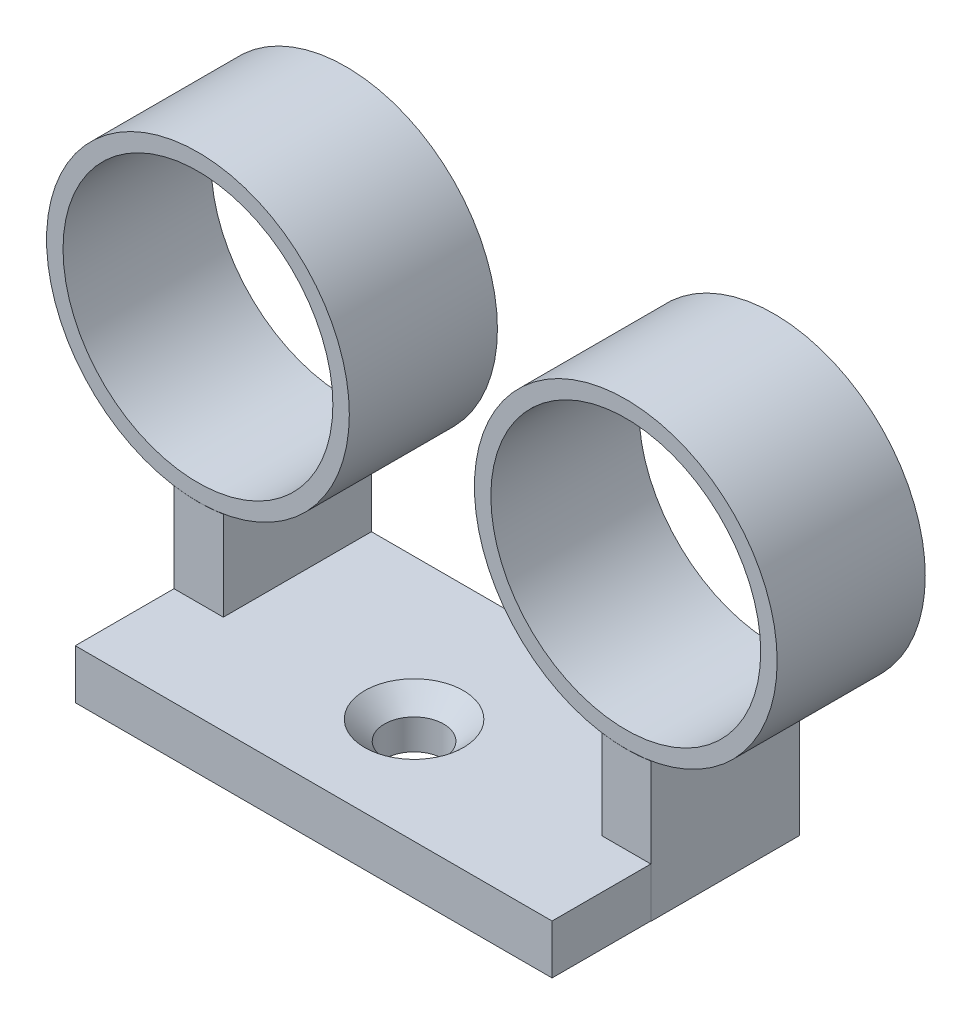
ISO-10303-21;
HEADER;
FILE_DESCRIPTION(('STEP AP214'),'2;1');
FILE_NAME('part.step','',(''),(''),'','','');
FILE_SCHEMA(('AUTOMOTIVE_DESIGN { 1 0 10303 214 1 1 1 1 }'));
ENDSEC;
DATA;
#1=APPLICATION_CONTEXT('core data for automotive mechanical design processes');
#2=APPLICATION_PROTOCOL_DEFINITION('international standard','automotive_design',2000,#1);
#3=PRODUCT_CONTEXT('',#1,'mechanical');
#4=PRODUCT('Part','Part','',(#3));
#5=PRODUCT_RELATED_PRODUCT_CATEGORY('part','',(#4));
#6=PRODUCT_DEFINITION_FORMATION('','',#4);
#7=PRODUCT_DEFINITION_CONTEXT('part definition',#1,'design');
#8=PRODUCT_DEFINITION('design','',#6,#7);
#9=PRODUCT_DEFINITION_SHAPE('','',#8);
#10=(LENGTH_UNIT() NAMED_UNIT(*) SI_UNIT(.MILLI.,.METRE.));
#11=(NAMED_UNIT(*) PLANE_ANGLE_UNIT() SI_UNIT($,.RADIAN.));
#12=(NAMED_UNIT(*) SI_UNIT($,.STERADIAN.) SOLID_ANGLE_UNIT());
#13=UNCERTAINTY_MEASURE_WITH_UNIT(LENGTH_MEASURE(1.E-05),#10,'distance_accuracy_value','');
#14=(GEOMETRIC_REPRESENTATION_CONTEXT(3) GLOBAL_UNCERTAINTY_ASSIGNED_CONTEXT((#13)) GLOBAL_UNIT_ASSIGNED_CONTEXT((#10,
#11,#12)) REPRESENTATION_CONTEXT('',''));
#15=CARTESIAN_POINT('',(0.,0.,0.));
#16=DIRECTION('',(0.,0.,1.));
#17=DIRECTION('',(1.,0.,0.));
#18=AXIS2_PLACEMENT_3D('',#15,#16,#17);
#19=CARTESIAN_POINT('',(0.,3.43905375415282,0.));
#20=DIRECTION('',(0.,1.,0.));
#21=DIRECTION('',(0.,0.,1.));
#22=AXIS2_PLACEMENT_3D('',#19,#20,#21);
#23=PLANE('',#22);
#24=CARTESIAN_POINT('',(14.1563485968457,3.43905375415282,8.56621810474091));
#25=DIRECTION('',(0.,1.,0.));
#26=DIRECTION('',(0.,0.,1.));
#27=AXIS2_PLACEMENT_3D('',#24,#25,#26);
#28=CIRCLE('',#27,3.);
#29=CARTESIAN_POINT('',(14.1563485968457,3.43905375415282,11.5662181047409));
#30=VERTEX_POINT('',#29);
#31=EDGE_CURVE('E297',#30,#30,#28,.T.);
#32=ORIENTED_EDGE('',*,*,#31,.F.);
#33=EDGE_LOOP('',(#32));
#34=FACE_BOUND('',#33,.T.);
#35=DIRECTION('',(1.,0.,0.));
#36=VECTOR('',#35,1.);
#37=CARTESIAN_POINT('',(0.,3.43905375415282,9.));
#38=LINE('',#37,#36);
#39=CARTESIAN_POINT('',(26.,3.43905375415282,9.));
#40=VERTEX_POINT('',#39);
#41=CARTESIAN_POINT('',(28.9773860584858,3.43905375415282,9.));
#42=VERTEX_POINT('',#41);
#43=EDGE_CURVE('E147',#40,#42,#38,.T.);
#44=ORIENTED_EDGE('',*,*,#43,.F.);
#45=DIRECTION('',(0.,0.,-1.));
#46=VECTOR('',#45,1.);
#47=CARTESIAN_POINT('',(26.,3.43905375415282,0.));
#48=LINE('',#47,#46);
#49=CARTESIAN_POINT('',(26.,3.43905375415282,0.));
#50=VERTEX_POINT('',#49);
#51=EDGE_CURVE('E12',#40,#50,#48,.T.);
#52=ORIENTED_EDGE('',*,*,#51,.T.);
#53=DIRECTION('',(1.,0.,0.));
#54=VECTOR('',#53,1.);
#55=CARTESIAN_POINT('',(0.,3.43905375415282,0.));
#56=LINE('',#55,#54);
#57=CARTESIAN_POINT('',(3.,3.43905375415282,0.));
#58=VERTEX_POINT('',#57);
#59=EDGE_CURVE('E173',#58,#50,#56,.T.);
#60=ORIENTED_EDGE('',*,*,#59,.F.);
#61=DIRECTION('',(0.,0.,-1.));
#62=VECTOR('',#61,1.);
#63=CARTESIAN_POINT('',(3.,3.43905375415282,9.));
#64=LINE('',#63,#62);
#65=CARTESIAN_POINT('',(3.,3.43905375415282,9.));
#66=VERTEX_POINT('',#65);
#67=EDGE_CURVE('E192',#66,#58,#64,.T.);
#68=ORIENTED_EDGE('',*,*,#67,.F.);
#69=DIRECTION('',(-1.,0.,0.));
#70=VECTOR('',#69,1.);
#71=CARTESIAN_POINT('',(1.5,3.43905375415282,9.));
#72=LINE('',#71,#70);
#73=CARTESIAN_POINT('',(0.,3.43905375415282,9.));
#74=VERTEX_POINT('',#73);
#75=EDGE_CURVE('E62',#66,#74,#72,.T.);
#76=ORIENTED_EDGE('',*,*,#75,.T.);
#77=DIRECTION('',(0.,0.,-1.));
#78=VECTOR('',#77,1.);
#79=CARTESIAN_POINT('',(0.,3.43905375415282,0.));
#80=LINE('',#79,#78);
#81=CARTESIAN_POINT('',(0.,3.43905375415282,15.));
#82=VERTEX_POINT('',#81);
#83=EDGE_CURVE('E170',#82,#74,#80,.T.);
#84=ORIENTED_EDGE('',*,*,#83,.F.);
#85=DIRECTION('',(-1.,0.,0.));
#86=VECTOR('',#85,1.);
#87=CARTESIAN_POINT('',(0.,3.43905375415282,15.));
#88=LINE('',#87,#86);
#89=CARTESIAN_POINT('',(28.9773860584858,3.43905375415282,15.));
#90=VERTEX_POINT('',#89);
#91=EDGE_CURVE('E179',#90,#82,#88,.T.);
#92=ORIENTED_EDGE('',*,*,#91,.F.);
#93=DIRECTION('',(0.,0.,1.));
#94=VECTOR('',#93,1.);
#95=CARTESIAN_POINT('',(28.9773860584858,3.43905375415282,0.));
#96=LINE('',#95,#94);
#97=EDGE_CURVE('E177',#42,#90,#96,.T.);
#98=ORIENTED_EDGE('',*,*,#97,.F.);
#99=EDGE_LOOP('',(#44,#52,#60,#68,#76,#84,#92,#98));
#100=FACE_BOUND('',#99,.T.);
#101=ADVANCED_FACE('F46',(#34,#100),#23,.T.);
#102=CARTESIAN_POINT('',(0.,0.439053754152822,9.));
#103=DIRECTION('',(1.,0.,0.));
#104=DIRECTION('',(0.,0.,-1.));
#105=AXIS2_PLACEMENT_3D('',#102,#103,#104);
#106=PLANE('',#105);
#107=DIRECTION('',(0.,-1.,0.));
#108=VECTOR('',#107,1.);
#109=CARTESIAN_POINT('',(0.,0.439053754152822,0.));
#110=LINE('',#109,#108);
#111=CARTESIAN_POINT('',(0.,8.85905375415282,0.));
#112=VERTEX_POINT('',#111);
#113=CARTESIAN_POINT('',(0.,0.439053754152822,0.));
#114=VERTEX_POINT('',#113);
#115=EDGE_CURVE('E194',#112,#114,#110,.T.);
#116=ORIENTED_EDGE('',*,*,#115,.T.);
#117=DIRECTION('',(0.,0.,-1.));
#118=VECTOR('',#117,1.);
#119=CARTESIAN_POINT('',(0.,0.439053754152822,9.));
#120=LINE('',#119,#118);
#121=CARTESIAN_POINT('',(0.,0.439053754152822,15.));
#122=VERTEX_POINT('',#121);
#123=EDGE_CURVE('E212',#122,#114,#120,.T.);
#124=ORIENTED_EDGE('',*,*,#123,.F.);
#125=DIRECTION('',(0.,-1.,0.));
#126=VECTOR('',#125,1.);
#127=CARTESIAN_POINT('',(0.,3.43905375415282,15.));
#128=LINE('',#127,#126);
#129=EDGE_CURVE('E186',#82,#122,#128,.T.);
#130=ORIENTED_EDGE('',*,*,#129,.F.);
#131=ORIENTED_EDGE('',*,*,#83,.T.);
#132=DIRECTION('',(0.,-1.,0.));
#133=VECTOR('',#132,1.);
#134=CARTESIAN_POINT('',(0.,0.439053754152822,9.));
#135=LINE('',#134,#133);
#136=CARTESIAN_POINT('',(0.,8.85905375415282,9.));
#137=VERTEX_POINT('',#136);
#138=EDGE_CURVE('E67',#137,#74,#135,.T.);
#139=ORIENTED_EDGE('',*,*,#138,.F.);
#140=DIRECTION('',(0.,0.,-1.));
#141=VECTOR('',#140,1.);
#142=CARTESIAN_POINT('',(0.,8.85905375415282,9.));
#143=LINE('',#142,#141);
#144=EDGE_CURVE('E201',#137,#112,#143,.T.);
#145=ORIENTED_EDGE('',*,*,#144,.T.);
#146=EDGE_LOOP('',(#116,#124,#130,#131,#139,#145));
#147=FACE_BOUND('',#146,.T.);
#148=ADVANCED_FACE('F48',(#147),#106,.F.);
#149=CARTESIAN_POINT('',(0.,0.439053754152822,9.));
#150=DIRECTION('',(0.,1.,0.));
#151=DIRECTION('',(0.,0.,1.));
#152=AXIS2_PLACEMENT_3D('',#149,#150,#151);
#153=PLANE('',#152);
#154=CARTESIAN_POINT('',(14.1563485968457,0.439053754152822,8.56621810474091));
#155=DIRECTION('',(0.,1.,0.));
#156=DIRECTION('',(0.,0.,1.));
#157=AXIS2_PLACEMENT_3D('',#154,#155,#156);
#158=CIRCLE('',#157,1.79999999999999);
#159=CARTESIAN_POINT('',(14.1563485968457,0.439053754152822,10.3662181047409));
#160=VERTEX_POINT('',#159);
#161=EDGE_CURVE('E50',#160,#160,#158,.T.);
#162=ORIENTED_EDGE('',*,*,#161,.T.);
#163=EDGE_LOOP('',(#162));
#164=FACE_BOUND('',#163,.T.);
#165=DIRECTION('',(1.,0.,0.));
#166=VECTOR('',#165,1.);
#167=CARTESIAN_POINT('',(0.,0.439053754152822,0.));
#168=LINE('',#167,#166);
#169=CARTESIAN_POINT('',(29.,0.439053754152822,0.));
#170=VERTEX_POINT('',#169);
#171=EDGE_CURVE('E144',#114,#170,#168,.T.);
#172=ORIENTED_EDGE('',*,*,#171,.T.);
#173=DIRECTION('',(0.,0.,-1.));
#174=VECTOR('',#173,1.);
#175=CARTESIAN_POINT('',(29.,0.439053754152822,9.));
#176=LINE('',#175,#174);
#177=CARTESIAN_POINT('',(29.,0.439053754152822,9.));
#178=VERTEX_POINT('',#177);
#179=EDGE_CURVE('E140',#178,#170,#176,.T.);
#180=ORIENTED_EDGE('',*,*,#179,.F.);
#181=DIRECTION('',(1.,0.,0.));
#182=VECTOR('',#181,1.);
#183=CARTESIAN_POINT('',(26.,0.439053754152822,9.));
#184=LINE('',#183,#182);
#185=CARTESIAN_POINT('',(28.9773860584858,0.439053754152822,9.));
#186=VERTEX_POINT('',#185);
#187=EDGE_CURVE('E127',#186,#178,#184,.T.);
#188=ORIENTED_EDGE('',*,*,#187,.F.);
#189=DIRECTION('',(0.,0.,1.));
#190=VECTOR('',#189,1.);
#191=CARTESIAN_POINT('',(28.9773860584858,0.439053754152822,0.));
#192=LINE('',#191,#190);
#193=CARTESIAN_POINT('',(28.9773860584858,0.439053754152822,15.));
#194=VERTEX_POINT('',#193);
#195=EDGE_CURVE('E169',#186,#194,#192,.T.);
#196=ORIENTED_EDGE('',*,*,#195,.T.);
#197=DIRECTION('',(-1.,0.,0.));
#198=VECTOR('',#197,1.);
#199=CARTESIAN_POINT('',(0.,0.439053754152822,15.));
#200=LINE('',#199,#198);
#201=EDGE_CURVE('E174',#194,#122,#200,.T.);
#202=ORIENTED_EDGE('',*,*,#201,.T.);
#203=ORIENTED_EDGE('',*,*,#123,.T.);
#204=EDGE_LOOP('',(#172,#180,#188,#196,#202,#203));
#205=FACE_BOUND('',#204,.T.);
#206=ADVANCED_FACE('F141',(#164,#205),#153,.F.);
#207=CARTESIAN_POINT('',(3.,0.439053754152822,9.));
#208=DIRECTION('',(-1.,0.,0.));
#209=DIRECTION('',(0.,0.,1.));
#210=AXIS2_PLACEMENT_3D('',#207,#208,#209);
#211=PLANE('',#210);
#212=DIRECTION('',(0.,1.,0.));
#213=VECTOR('',#212,1.);
#214=CARTESIAN_POINT('',(3.,0.439053754152822,9.));
#215=LINE('',#214,#213);
#216=CARTESIAN_POINT('',(3.,8.85905375415282,9.));
#217=VERTEX_POINT('',#216);
#218=EDGE_CURVE('E196',#66,#217,#215,.T.);
#219=ORIENTED_EDGE('',*,*,#218,.F.);
#220=ORIENTED_EDGE('',*,*,#67,.T.);
#221=DIRECTION('',(0.,1.,0.));
#222=VECTOR('',#221,1.);
#223=CARTESIAN_POINT('',(3.,0.439053754152822,0.));
#224=LINE('',#223,#222);
#225=CARTESIAN_POINT('',(3.,8.85905375415282,0.));
#226=VERTEX_POINT('',#225);
#227=EDGE_CURVE('E204',#58,#226,#224,.T.);
#228=ORIENTED_EDGE('',*,*,#227,.T.);
#229=DIRECTION('',(0.,0.,-1.));
#230=VECTOR('',#229,1.);
#231=CARTESIAN_POINT('',(3.,8.85905375415282,9.));
#232=LINE('',#231,#230);
#233=EDGE_CURVE('E209',#217,#226,#232,.T.);
#234=ORIENTED_EDGE('',*,*,#233,.F.);
#235=EDGE_LOOP('',(#219,#220,#228,#234));
#236=FACE_BOUND('',#235,.T.);
#237=ADVANCED_FACE('F243',(#236),#211,.F.);
#238=CARTESIAN_POINT('',(1.5,18.0414987254526,9.));
#239=DIRECTION('',(0.,0.,-1.));
#240=DIRECTION('',(-1.,0.,0.));
#241=AXIS2_PLACEMENT_3D('',#238,#239,#240);
#242=CYLINDRICAL_SURFACE('',#241,9.30415475209594);
#243=CARTESIAN_POINT('',(1.5,18.0414987254526,0.));
#244=DIRECTION('',(0.,0.,-1.));
#245=DIRECTION('',(1.,0.,0.));
#246=AXIS2_PLACEMENT_3D('',#243,#244,#245);
#247=CIRCLE('',#246,9.30415475209594);
#248=EDGE_CURVE('E197',#226,#112,#247,.T.);
#249=ORIENTED_EDGE('',*,*,#248,.T.);
#250=ORIENTED_EDGE('',*,*,#144,.F.);
#251=CARTESIAN_POINT('',(1.5,18.0414987254526,9.));
#252=DIRECTION('',(0.,0.,-1.));
#253=DIRECTION('',(1.,0.,0.));
#254=AXIS2_PLACEMENT_3D('',#251,#252,#253);
#255=CIRCLE('',#254,9.30415475209594);
#256=EDGE_CURVE('E199',#217,#137,#255,.T.);
#257=ORIENTED_EDGE('',*,*,#256,.F.);
#258=ORIENTED_EDGE('',*,*,#233,.T.);
#259=EDGE_LOOP('',(#249,#250,#257,#258));
#260=FACE_BOUND('',#259,.T.);
#261=ADVANCED_FACE('F244',(#260),#242,.F.);
#262=CARTESIAN_POINT('',(1.5,18.0414987254526,9.));
#263=DIRECTION('',(0.,0.,1.));
#264=DIRECTION('',(1.,0.,0.));
#265=AXIS2_PLACEMENT_3D('',#262,#263,#264);
#266=PLANE('',#265);
#267=ORIENTED_EDGE('',*,*,#75,.F.);
#268=ORIENTED_EDGE('',*,*,#218,.T.);
#269=ORIENTED_EDGE('',*,*,#256,.T.);
#270=ORIENTED_EDGE('',*,*,#138,.T.);
#271=EDGE_LOOP('',(#267,#268,#269,#270));
#272=FACE_BOUND('',#271,.T.);
#273=ADVANCED_FACE('F245',(#272),#266,.T.);
#274=CARTESIAN_POINT('',(1.5,18.0414987254526,0.));
#275=DIRECTION('',(0.,0.,1.));
#276=DIRECTION('',(1.,0.,0.));
#277=AXIS2_PLACEMENT_3D('',#274,#275,#276);
#278=PLANE('',#277);
#279=DIRECTION('',(0.,1.,0.));
#280=VECTOR('',#279,1.);
#281=CARTESIAN_POINT('',(29.,0.439053754152822,0.));
#282=LINE('',#281,#280);
#283=CARTESIAN_POINT('',(29.,8.85905375415282,0.));
#284=VERTEX_POINT('',#283);
#285=EDGE_CURVE('E161',#170,#284,#282,.T.);
#286=ORIENTED_EDGE('',*,*,#285,.F.);
#287=ORIENTED_EDGE('',*,*,#171,.F.);
#288=ORIENTED_EDGE('',*,*,#115,.F.);
#289=ORIENTED_EDGE('',*,*,#248,.F.);
#290=ORIENTED_EDGE('',*,*,#227,.F.);
#291=ORIENTED_EDGE('',*,*,#59,.T.);
#292=DIRECTION('',(0.,-1.,0.));
#293=VECTOR('',#292,1.);
#294=CARTESIAN_POINT('',(26.,0.439053754152822,0.));
#295=LINE('',#294,#293);
#296=CARTESIAN_POINT('',(26.,8.85905375415282,0.));
#297=VERTEX_POINT('',#296);
#298=EDGE_CURVE('E159',#297,#50,#295,.T.);
#299=ORIENTED_EDGE('',*,*,#298,.F.);
#300=CARTESIAN_POINT('',(27.5,18.0414987254526,0.));
#301=DIRECTION('',(0.,0.,-1.));
#302=DIRECTION('',(1.,0.,0.));
#303=AXIS2_PLACEMENT_3D('',#300,#301,#302);
#304=CIRCLE('',#303,9.30415475209594);
#305=EDGE_CURVE('E163',#284,#297,#304,.T.);
#306=ORIENTED_EDGE('',*,*,#305,.F.);
#307=EDGE_LOOP('',(#286,#287,#288,#289,#290,#291,#299,#306));
#308=FACE_BOUND('',#307,.T.);
#309=ADVANCED_FACE('F231',(#308),#278,.F.);
#310=CARTESIAN_POINT('',(0.,3.43905375415282,15.));
#311=DIRECTION('',(0.,0.,1.));
#312=DIRECTION('',(1.,0.,0.));
#313=AXIS2_PLACEMENT_3D('',#310,#311,#312);
#314=PLANE('',#313);
#315=ORIENTED_EDGE('',*,*,#201,.F.);
#316=DIRECTION('',(0.,-1.,0.));
#317=VECTOR('',#316,1.);
#318=CARTESIAN_POINT('',(28.9773860584858,3.43905375415282,15.));
#319=LINE('',#318,#317);
#320=EDGE_CURVE('E182',#90,#194,#319,.T.);
#321=ORIENTED_EDGE('',*,*,#320,.F.);
#322=ORIENTED_EDGE('',*,*,#91,.T.);
#323=ORIENTED_EDGE('',*,*,#129,.T.);
#324=EDGE_LOOP('',(#315,#321,#322,#323));
#325=FACE_BOUND('',#324,.T.);
#326=ADVANCED_FACE('F219',(#325),#314,.T.);
#327=CARTESIAN_POINT('',(28.9773860584858,3.43905375415282,0.));
#328=DIRECTION('',(1.,0.,0.));
#329=DIRECTION('',(0.,0.,-1.));
#330=AXIS2_PLACEMENT_3D('',#327,#328,#329);
#331=PLANE('',#330);
#332=DIRECTION('',(0.,-1.,0.));
#333=VECTOR('',#332,1.);
#334=CARTESIAN_POINT('',(28.9773860584858,3.43905375415282,9.));
#335=LINE('',#334,#333);
#336=EDGE_CURVE('E55',#42,#186,#335,.T.);
#337=ORIENTED_EDGE('',*,*,#336,.F.);
#338=ORIENTED_EDGE('',*,*,#97,.T.);
#339=ORIENTED_EDGE('',*,*,#320,.T.);
#340=ORIENTED_EDGE('',*,*,#195,.F.);
#341=EDGE_LOOP('',(#337,#338,#339,#340));
#342=FACE_BOUND('',#341,.T.);
#343=ADVANCED_FACE('F267',(#342),#331,.T.);
#344=CARTESIAN_POINT('',(26.,0.439053754152822,9.));
#345=DIRECTION('',(1.,0.,0.));
#346=DIRECTION('',(0.,0.,-1.));
#347=AXIS2_PLACEMENT_3D('',#344,#345,#346);
#348=PLANE('',#347);
#349=ORIENTED_EDGE('',*,*,#51,.F.);
#350=DIRECTION('',(0.,-1.,0.));
#351=VECTOR('',#350,1.);
#352=CARTESIAN_POINT('',(26.,0.439053754152822,9.));
#353=LINE('',#352,#351);
#354=CARTESIAN_POINT('',(26.,8.85905375415282,9.));
#355=VERTEX_POINT('',#354);
#356=EDGE_CURVE('E137',#355,#40,#353,.T.);
#357=ORIENTED_EDGE('',*,*,#356,.F.);
#358=DIRECTION('',(0.,0.,-1.));
#359=VECTOR('',#358,1.);
#360=CARTESIAN_POINT('',(26.,8.85905375415282,9.));
#361=LINE('',#360,#359);
#362=EDGE_CURVE('E155',#355,#297,#361,.T.);
#363=ORIENTED_EDGE('',*,*,#362,.T.);
#364=ORIENTED_EDGE('',*,*,#298,.T.);
#365=EDGE_LOOP('',(#349,#357,#363,#364));
#366=FACE_BOUND('',#365,.T.);
#367=ADVANCED_FACE('F264',(#366),#348,.F.);
#368=CARTESIAN_POINT('',(29.,0.439053754152822,9.));
#369=DIRECTION('',(-1.,0.,0.));
#370=DIRECTION('',(0.,0.,1.));
#371=AXIS2_PLACEMENT_3D('',#368,#369,#370);
#372=PLANE('',#371);
#373=ORIENTED_EDGE('',*,*,#285,.T.);
#374=DIRECTION('',(0.,0.,-1.));
#375=VECTOR('',#374,1.);
#376=CARTESIAN_POINT('',(29.,8.85905375415282,9.));
#377=LINE('',#376,#375);
#378=CARTESIAN_POINT('',(29.,8.85905375415282,9.));
#379=VERTEX_POINT('',#378);
#380=EDGE_CURVE('E148',#379,#284,#377,.T.);
#381=ORIENTED_EDGE('',*,*,#380,.F.);
#382=DIRECTION('',(0.,1.,0.));
#383=VECTOR('',#382,1.);
#384=CARTESIAN_POINT('',(29.,0.439053754152822,9.));
#385=LINE('',#384,#383);
#386=EDGE_CURVE('E132',#178,#379,#385,.T.);
#387=ORIENTED_EDGE('',*,*,#386,.F.);
#388=ORIENTED_EDGE('',*,*,#179,.T.);
#389=EDGE_LOOP('',(#373,#381,#387,#388));
#390=FACE_BOUND('',#389,.T.);
#391=ADVANCED_FACE('F150',(#390),#372,.F.);
#392=CARTESIAN_POINT('',(27.5,18.0414987254526,9.));
#393=DIRECTION('',(0.,0.,-1.));
#394=DIRECTION('',(-1.,0.,0.));
#395=AXIS2_PLACEMENT_3D('',#392,#393,#394);
#396=CYLINDRICAL_SURFACE('',#395,9.30415475209594);
#397=ORIENTED_EDGE('',*,*,#305,.T.);
#398=ORIENTED_EDGE('',*,*,#362,.F.);
#399=CARTESIAN_POINT('',(27.5,18.0414987254526,9.));
#400=DIRECTION('',(0.,0.,-1.));
#401=DIRECTION('',(1.,0.,0.));
#402=AXIS2_PLACEMENT_3D('',#399,#400,#401);
#403=CIRCLE('',#402,9.30415475209594);
#404=EDGE_CURVE('E153',#379,#355,#403,.T.);
#405=ORIENTED_EDGE('',*,*,#404,.F.);
#406=ORIENTED_EDGE('',*,*,#380,.T.);
#407=EDGE_LOOP('',(#397,#398,#405,#406));
#408=FACE_BOUND('',#407,.T.);
#409=ADVANCED_FACE('F236',(#408),#396,.F.);
#410=CARTESIAN_POINT('',(27.5,18.0414987254526,9.));
#411=DIRECTION('',(0.,0.,1.));
#412=DIRECTION('',(1.,0.,0.));
#413=AXIS2_PLACEMENT_3D('',#410,#411,#412);
#414=PLANE('',#413);
#415=ORIENTED_EDGE('',*,*,#356,.T.);
#416=ORIENTED_EDGE('',*,*,#43,.T.);
#417=ORIENTED_EDGE('',*,*,#336,.T.);
#418=ORIENTED_EDGE('',*,*,#187,.T.);
#419=ORIENTED_EDGE('',*,*,#386,.T.);
#420=ORIENTED_EDGE('',*,*,#404,.T.);
#421=EDGE_LOOP('',(#415,#416,#417,#418,#419,#420));
#422=FACE_BOUND('',#421,.T.);
#423=ADVANCED_FACE('F130',(#422),#414,.T.);
#424=CARTESIAN_POINT('',(14.1563485968457,3.43905375415282,8.56621810474091));
#425=DIRECTION('',(0.,1.,0.));
#426=DIRECTION('',(0.,0.,1.));
#427=AXIS2_PLACEMENT_3D('',#424,#425,#426);
#428=CYLINDRICAL_SURFACE('',#427,1.79999999999999);
#429=CARTESIAN_POINT('',(14.1563485968457,2.28022722438433,8.56621810474091));
#430=DIRECTION('',(0.,1.,0.));
#431=DIRECTION('',(0.,0.,1.));
#432=AXIS2_PLACEMENT_3D('',#429,#430,#431);
#433=CIRCLE('',#432,1.8);
#434=CARTESIAN_POINT('',(14.1563485968457,2.28022722438433,10.3662181047409));
#435=VERTEX_POINT('',#434);
#436=EDGE_CURVE('E295',#435,#435,#433,.T.);
#437=ORIENTED_EDGE('',*,*,#436,.T.);
#438=EDGE_LOOP('',(#437));
#439=FACE_BOUND('',#438,.T.);
#440=ORIENTED_EDGE('',*,*,#161,.F.);
#441=EDGE_LOOP('',(#440));
#442=FACE_BOUND('',#441,.T.);
#443=ADVANCED_FACE('F283',(#439,#442),#428,.F.);
#444=CARTESIAN_POINT('',(14.1563485968457,3.43905375415282,8.56621810474091));
#445=DIRECTION('',(0.,1.,0.));
#446=DIRECTION('',(0.,0.,1.));
#447=AXIS2_PLACEMENT_3D('',#444,#445,#446);
#448=CONICAL_SURFACE('',#447,3.,0.802851455917391);
#449=ORIENTED_EDGE('',*,*,#436,.F.);
#450=EDGE_LOOP('',(#449));
#451=FACE_BOUND('',#450,.T.);
#452=ORIENTED_EDGE('',*,*,#31,.T.);
#453=EDGE_LOOP('',(#452));
#454=FACE_BOUND('',#453,.T.);
#455=ADVANCED_FACE('F286',(#451,#454),#448,.F.);
#456=CLOSED_SHELL('',(#101,#148,#206,#237,#261,#273,#309,#326,#343,#367,#391,#409,#423,#443,#455));
#457=MANIFOLD_SOLID_BREP('B2',#456);
#458=CARTESIAN_POINT('',(27.4562224388042,17.9430735806791,9.));
#459=DIRECTION('',(0.,0.,1.));
#460=DIRECTION('',(1.,0.,0.));
#461=AXIS2_PLACEMENT_3D('',#458,#459,#460);
#462=PLANE('',#461);
#463=CARTESIAN_POINT('',(27.4562224388042,17.9430735806791,9.));
#464=DIRECTION('',(0.,0.,1.));
#465=DIRECTION('',(1.,0.,0.));
#466=AXIS2_PLACEMENT_3D('',#463,#464,#465);
#467=CIRCLE('',#466,9.19999999999999);
#468=CARTESIAN_POINT('',(36.6562224388042,17.9430735806791,9.));
#469=VERTEX_POINT('',#468);
#470=EDGE_CURVE('E453',#469,#469,#467,.T.);
#471=ORIENTED_EDGE('',*,*,#470,.T.);
#472=EDGE_LOOP('',(#471));
#473=FACE_BOUND('',#472,.T.);
#474=CARTESIAN_POINT('',(27.4562224388042,17.9430735806791,9.));
#475=DIRECTION('',(0.,0.,1.));
#476=DIRECTION('',(1.,0.,0.));
#477=AXIS2_PLACEMENT_3D('',#474,#475,#476);
#478=CIRCLE('',#477,8.2);
#479=CARTESIAN_POINT('',(35.6562224388042,17.9430735806791,9.));
#480=VERTEX_POINT('',#479);
#481=EDGE_CURVE('E444',#480,#480,#478,.T.);
#482=ORIENTED_EDGE('',*,*,#481,.F.);
#483=EDGE_LOOP('',(#482));
#484=FACE_BOUND('',#483,.T.);
#485=ADVANCED_FACE('F440',(#473,#484),#462,.T.);
#486=CARTESIAN_POINT('',(27.4562224388042,17.9430735806791,0.));
#487=DIRECTION('',(0.,0.,1.));
#488=DIRECTION('',(1.,0.,0.));
#489=AXIS2_PLACEMENT_3D('',#486,#487,#488);
#490=PLANE('',#489);
#491=CARTESIAN_POINT('',(27.4562224388042,17.9430735806791,0.));
#492=DIRECTION('',(0.,0.,1.));
#493=DIRECTION('',(1.,0.,0.));
#494=AXIS2_PLACEMENT_3D('',#491,#492,#493);
#495=CIRCLE('',#494,9.19999999999999);
#496=CARTESIAN_POINT('',(36.6562224388042,17.9430735806791,0.));
#497=VERTEX_POINT('',#496);
#498=EDGE_CURVE('E451',#497,#497,#495,.T.);
#499=ORIENTED_EDGE('',*,*,#498,.F.);
#500=EDGE_LOOP('',(#499));
#501=FACE_BOUND('',#500,.T.);
#502=CARTESIAN_POINT('',(27.4562224388042,17.9430735806791,0.));
#503=DIRECTION('',(0.,0.,1.));
#504=DIRECTION('',(1.,0.,0.));
#505=AXIS2_PLACEMENT_3D('',#502,#503,#504);
#506=CIRCLE('',#505,8.2);
#507=CARTESIAN_POINT('',(35.6562224388042,17.9430735806791,0.));
#508=VERTEX_POINT('',#507);
#509=EDGE_CURVE('E45',#508,#508,#506,.T.);
#510=ORIENTED_EDGE('',*,*,#509,.T.);
#511=EDGE_LOOP('',(#510));
#512=FACE_BOUND('',#511,.T.);
#513=ADVANCED_FACE('F461',(#501,#512),#490,.F.);
#514=CARTESIAN_POINT('',(27.4562224388042,17.9430735806791,9.));
#515=DIRECTION('',(0.,0.,-1.));
#516=DIRECTION('',(-1.,0.,0.));
#517=AXIS2_PLACEMENT_3D('',#514,#515,#516);
#518=CYLINDRICAL_SURFACE('',#517,9.19999999999999);
#519=ORIENTED_EDGE('',*,*,#470,.F.);
#520=EDGE_LOOP('',(#519));
#521=FACE_BOUND('',#520,.T.);
#522=ORIENTED_EDGE('',*,*,#498,.T.);
#523=EDGE_LOOP('',(#522));
#524=FACE_BOUND('',#523,.T.);
#525=ADVANCED_FACE('F459',(#521,#524),#518,.T.);
#526=CARTESIAN_POINT('',(27.4562224388042,17.9430735806791,9.));
#527=DIRECTION('',(0.,0.,-1.));
#528=DIRECTION('',(-1.,0.,0.));
#529=AXIS2_PLACEMENT_3D('',#526,#527,#528);
#530=CYLINDRICAL_SURFACE('',#529,8.2);
#531=ORIENTED_EDGE('',*,*,#481,.T.);
#532=EDGE_LOOP('',(#531));
#533=FACE_BOUND('',#532,.T.);
#534=ORIENTED_EDGE('',*,*,#509,.F.);
#535=EDGE_LOOP('',(#534));
#536=FACE_BOUND('',#535,.T.);
#537=ADVANCED_FACE('F442',(#533,#536),#530,.F.);
#538=CLOSED_SHELL('',(#485,#513,#525,#537));
#539=MANIFOLD_SOLID_BREP('B6',#538);
#540=CARTESIAN_POINT('',(1.45622243880416,17.9430735806791,9.));
#541=DIRECTION('',(0.,0.,1.));
#542=DIRECTION('',(1.,0.,0.));
#543=AXIS2_PLACEMENT_3D('',#540,#541,#542);
#544=PLANE('',#543);
#545=CARTESIAN_POINT('',(1.45622243880416,17.9430735806791,9.));
#546=DIRECTION('',(0.,0.,1.));
#547=DIRECTION('',(1.,0.,0.));
#548=AXIS2_PLACEMENT_3D('',#545,#546,#547);
#549=CIRCLE('',#548,9.2);
#550=CARTESIAN_POINT('',(10.6562224388042,17.9430735806791,9.));
#551=VERTEX_POINT('',#550);
#552=EDGE_CURVE('E439',#551,#551,#549,.T.);
#553=ORIENTED_EDGE('',*,*,#552,.T.);
#554=EDGE_LOOP('',(#553));
#555=FACE_BOUND('',#554,.T.);
#556=CARTESIAN_POINT('',(1.45622243880416,17.9430735806791,9.));
#557=DIRECTION('',(0.,0.,1.));
#558=DIRECTION('',(1.,0.,0.));
#559=AXIS2_PLACEMENT_3D('',#556,#557,#558);
#560=CIRCLE('',#559,8.2);
#561=CARTESIAN_POINT('',(9.65622243880416,17.9430735806791,9.));
#562=VERTEX_POINT('',#561);
#563=EDGE_CURVE('E515',#562,#562,#560,.T.);
#564=ORIENTED_EDGE('',*,*,#563,.F.);
#565=EDGE_LOOP('',(#564));
#566=FACE_BOUND('',#565,.T.);
#567=ADVANCED_FACE('F504',(#555,#566),#544,.T.);
#568=CARTESIAN_POINT('',(1.45622243880416,17.9430735806791,0.));
#569=DIRECTION('',(0.,0.,1.));
#570=DIRECTION('',(1.,0.,0.));
#571=AXIS2_PLACEMENT_3D('',#568,#569,#570);
#572=PLANE('',#571);
#573=CARTESIAN_POINT('',(1.45622243880416,17.9430735806791,0.));
#574=DIRECTION('',(0.,0.,1.));
#575=DIRECTION('',(1.,0.,0.));
#576=AXIS2_PLACEMENT_3D('',#573,#574,#575);
#577=CIRCLE('',#576,9.2);
#578=CARTESIAN_POINT('',(10.6562224388042,17.9430735806791,0.));
#579=VERTEX_POINT('',#578);
#580=EDGE_CURVE('E508',#579,#579,#577,.T.);
#581=ORIENTED_EDGE('',*,*,#580,.F.);
#582=EDGE_LOOP('',(#581));
#583=FACE_BOUND('',#582,.T.);
#584=CARTESIAN_POINT('',(1.45622243880416,17.9430735806791,0.));
#585=DIRECTION('',(0.,0.,1.));
#586=DIRECTION('',(1.,0.,0.));
#587=AXIS2_PLACEMENT_3D('',#584,#585,#586);
#588=CIRCLE('',#587,8.2);
#589=CARTESIAN_POINT('',(9.65622243880416,17.9430735806791,0.));
#590=VERTEX_POINT('',#589);
#591=EDGE_CURVE('E517',#590,#590,#588,.T.);
#592=ORIENTED_EDGE('',*,*,#591,.T.);
#593=EDGE_LOOP('',(#592));
#594=FACE_BOUND('',#593,.T.);
#595=ADVANCED_FACE('F527',(#583,#594),#572,.F.);
#596=CARTESIAN_POINT('',(1.45622243880416,17.9430735806791,9.));
#597=DIRECTION('',(0.,0.,-1.));
#598=DIRECTION('',(-1.,0.,0.));
#599=AXIS2_PLACEMENT_3D('',#596,#597,#598);
#600=CYLINDRICAL_SURFACE('',#599,9.2);
#601=ORIENTED_EDGE('',*,*,#552,.F.);
#602=EDGE_LOOP('',(#601));
#603=FACE_BOUND('',#602,.T.);
#604=ORIENTED_EDGE('',*,*,#580,.T.);
#605=EDGE_LOOP('',(#604));
#606=FACE_BOUND('',#605,.T.);
#607=ADVANCED_FACE('F506',(#603,#606),#600,.T.);
#608=CARTESIAN_POINT('',(1.45622243880416,17.9430735806791,9.));
#609=DIRECTION('',(0.,0.,-1.));
#610=DIRECTION('',(-1.,0.,0.));
#611=AXIS2_PLACEMENT_3D('',#608,#609,#610);
#612=CYLINDRICAL_SURFACE('',#611,8.2);
#613=ORIENTED_EDGE('',*,*,#563,.T.);
#614=EDGE_LOOP('',(#613));
#615=FACE_BOUND('',#614,.T.);
#616=ORIENTED_EDGE('',*,*,#591,.F.);
#617=EDGE_LOOP('',(#616));
#618=FACE_BOUND('',#617,.T.);
#619=ADVANCED_FACE('F523',(#615,#618),#612,.F.);
#620=CLOSED_SHELL('',(#567,#595,#607,#619));
#621=MANIFOLD_SOLID_BREP('B40',#620);
#622=ADVANCED_BREP_SHAPE_REPRESENTATION('',(#18,#457,#539,#621),#14);
#623=SHAPE_DEFINITION_REPRESENTATION(#9,#622);
ENDSEC;
END-ISO-10303-21;
